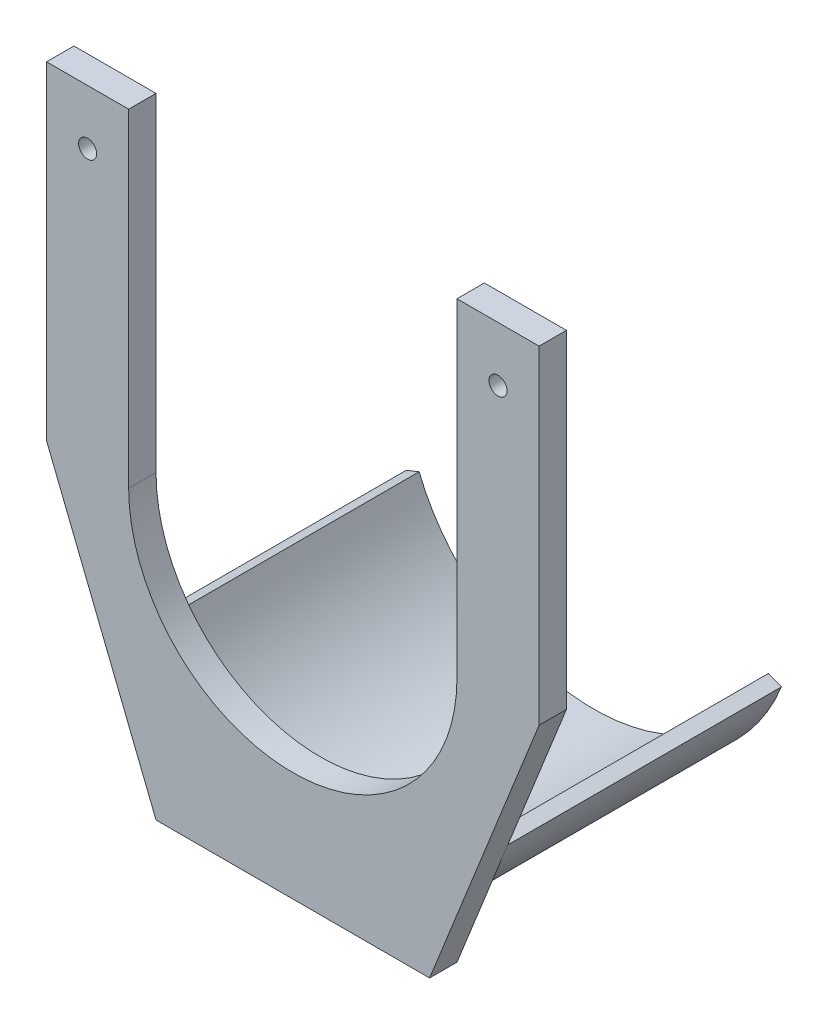
ISO-10303-21;
HEADER;
FILE_DESCRIPTION(('STEP AP214'),'2;1');
FILE_NAME('part.step','',(''),(''),'','','');
FILE_SCHEMA(('AUTOMOTIVE_DESIGN { 1 0 10303 214 1 1 1 1 }'));
ENDSEC;
DATA;
#1=APPLICATION_CONTEXT('core data for automotive mechanical design processes');
#2=APPLICATION_PROTOCOL_DEFINITION('international standard','automotive_design',2000,#1);
#3=PRODUCT_CONTEXT('',#1,'mechanical');
#4=PRODUCT('Part','Part','',(#3));
#5=PRODUCT_RELATED_PRODUCT_CATEGORY('part','',(#4));
#6=PRODUCT_DEFINITION_FORMATION('','',#4);
#7=PRODUCT_DEFINITION_CONTEXT('part definition',#1,'design');
#8=PRODUCT_DEFINITION('design','',#6,#7);
#9=PRODUCT_DEFINITION_SHAPE('','',#8);
#10=(LENGTH_UNIT() NAMED_UNIT(*) SI_UNIT(.MILLI.,.METRE.));
#11=(NAMED_UNIT(*) PLANE_ANGLE_UNIT() SI_UNIT($,.RADIAN.));
#12=(NAMED_UNIT(*) SI_UNIT($,.STERADIAN.) SOLID_ANGLE_UNIT());
#13=UNCERTAINTY_MEASURE_WITH_UNIT(LENGTH_MEASURE(1.E-05),#10,'distance_accuracy_value','');
#14=(GEOMETRIC_REPRESENTATION_CONTEXT(3) GLOBAL_UNCERTAINTY_ASSIGNED_CONTEXT((#13)) GLOBAL_UNIT_ASSIGNED_CONTEXT((#10,
#11,#12)) REPRESENTATION_CONTEXT('',''));
#15=CARTESIAN_POINT('',(0.,0.,0.));
#16=DIRECTION('',(0.,0.,1.));
#17=DIRECTION('',(1.,0.,0.));
#18=AXIS2_PLACEMENT_3D('',#15,#16,#17);
#19=CARTESIAN_POINT('',(0.,0.,0.));
#20=DIRECTION('',(0.,0.,1.));
#21=DIRECTION('',(1.,0.,0.));
#22=AXIS2_PLACEMENT_3D('',#19,#20,#21);
#23=PLANE('',#22);
#24=CARTESIAN_POINT('',(37.5,50.,0.));
#25=DIRECTION('',(0.,0.,1.));
#26=DIRECTION('',(-1.,0.,0.));
#27=AXIS2_PLACEMENT_3D('',#24,#25,#26);
#28=CIRCLE('',#27,1.65);
#29=CARTESIAN_POINT('',(35.85,50.,0.));
#30=VERTEX_POINT('',#29);
#31=EDGE_CURVE('E160',#30,#30,#28,.T.);
#32=ORIENTED_EDGE('',*,*,#31,.T.);
#33=EDGE_LOOP('',(#32));
#34=FACE_BOUND('',#33,.T.);
#35=CARTESIAN_POINT('',(-37.5,50.,0.));
#36=DIRECTION('',(0.,0.,1.));
#37=DIRECTION('',(1.,0.,0.));
#38=AXIS2_PLACEMENT_3D('',#35,#36,#37);
#39=CIRCLE('',#38,1.65);
#40=CARTESIAN_POINT('',(-35.85,50.,0.));
#41=VERTEX_POINT('',#40);
#42=EDGE_CURVE('E170',#41,#41,#39,.T.);
#43=ORIENTED_EDGE('',*,*,#42,.T.);
#44=EDGE_LOOP('',(#43));
#45=FACE_BOUND('',#44,.T.);
#46=DIRECTION('',(0.92847669088526,0.371390676354104,0.));
#47=VECTOR('',#46,1.);
#48=CARTESIAN_POINT('',(-31.9165535313274,-25.8407973768585,0.));
#49=LINE('',#48,#47);
#50=CARTESIAN_POINT('',(-34.2847669088526,-26.7880827278685,0.));
#51=VERTEX_POINT('',#50);
#52=CARTESIAN_POINT('',(-31.9165535313274,-25.8407973768585,0.));
#53=VERTEX_POINT('',#52);
#54=EDGE_CURVE('E157',#51,#53,#49,.T.);
#55=ORIENTED_EDGE('',*,*,#54,.F.);
#56=DIRECTION('',(0.371390676354104,-0.928476690885259,0.));
#57=VECTOR('',#56,1.);
#58=CARTESIAN_POINT('',(-45.,0.,0.));
#59=LINE('',#58,#57);
#60=CARTESIAN_POINT('',(-45.,0.,0.));
#61=VERTEX_POINT('',#60);
#62=EDGE_CURVE('E201',#61,#51,#59,.T.);
#63=ORIENTED_EDGE('',*,*,#62,.F.);
#64=DIRECTION('',(0.,-1.,0.));
#65=VECTOR('',#64,1.);
#66=CARTESIAN_POINT('',(-45.,0.,0.));
#67=LINE('',#66,#65);
#68=CARTESIAN_POINT('',(-45.,60.,0.));
#69=VERTEX_POINT('',#68);
#70=EDGE_CURVE('E182',#69,#61,#67,.T.);
#71=ORIENTED_EDGE('',*,*,#70,.F.);
#72=DIRECTION('',(-1.,0.,0.));
#73=VECTOR('',#72,1.);
#74=CARTESIAN_POINT('',(-45.,60.,0.));
#75=LINE('',#74,#73);
#76=CARTESIAN_POINT('',(-30.,60.,0.));
#77=VERTEX_POINT('',#76);
#78=EDGE_CURVE('E221',#77,#69,#75,.T.);
#79=ORIENTED_EDGE('',*,*,#78,.F.);
#80=DIRECTION('',(0.,1.,0.));
#81=VECTOR('',#80,1.);
#82=CARTESIAN_POINT('',(-30.,0.,0.));
#83=LINE('',#82,#81);
#84=CARTESIAN_POINT('',(-30.,0.,0.));
#85=VERTEX_POINT('',#84);
#86=EDGE_CURVE('E219',#85,#77,#83,.T.);
#87=ORIENTED_EDGE('',*,*,#86,.F.);
#88=CARTESIAN_POINT('',(0.,0.,0.));
#89=DIRECTION('',(0.,0.,-1.));
#90=DIRECTION('',(1.,0.,0.));
#91=AXIS2_PLACEMENT_3D('',#88,#89,#90);
#92=CIRCLE('',#91,30.);
#93=CARTESIAN_POINT('',(30.,0.,0.));
#94=VERTEX_POINT('',#93);
#95=EDGE_CURVE('E217',#94,#85,#92,.T.);
#96=ORIENTED_EDGE('',*,*,#95,.F.);
#97=DIRECTION('',(0.,-1.,0.));
#98=VECTOR('',#97,1.);
#99=CARTESIAN_POINT('',(30.,0.,0.));
#100=LINE('',#99,#98);
#101=CARTESIAN_POINT('',(30.,60.,0.));
#102=VERTEX_POINT('',#101);
#103=EDGE_CURVE('E215',#102,#94,#100,.T.);
#104=ORIENTED_EDGE('',*,*,#103,.F.);
#105=DIRECTION('',(-1.,0.,0.));
#106=VECTOR('',#105,1.);
#107=CARTESIAN_POINT('',(45.,60.,0.));
#108=LINE('',#107,#106);
#109=CARTESIAN_POINT('',(45.,60.,0.));
#110=VERTEX_POINT('',#109);
#111=EDGE_CURVE('E213',#110,#102,#108,.T.);
#112=ORIENTED_EDGE('',*,*,#111,.F.);
#113=DIRECTION('',(0.,1.,0.));
#114=VECTOR('',#113,1.);
#115=CARTESIAN_POINT('',(45.,0.,0.));
#116=LINE('',#115,#114);
#117=CARTESIAN_POINT('',(45.,0.,0.));
#118=VERTEX_POINT('',#117);
#119=EDGE_CURVE('E211',#118,#110,#116,.T.);
#120=ORIENTED_EDGE('',*,*,#119,.F.);
#121=DIRECTION('',(0.371390676354103,0.928476690885259,0.));
#122=VECTOR('',#121,1.);
#123=CARTESIAN_POINT('',(45.,0.,0.));
#124=LINE('',#123,#122);
#125=CARTESIAN_POINT('',(34.2847669088526,-26.7880827278685,0.));
#126=VERTEX_POINT('',#125);
#127=EDGE_CURVE('E208',#126,#118,#124,.T.);
#128=ORIENTED_EDGE('',*,*,#127,.F.);
#129=DIRECTION('',(0.92847669088526,-0.371390676354104,0.));
#130=VECTOR('',#129,1.);
#131=CARTESIAN_POINT('',(31.9165535313274,-25.8407973768585,0.));
#132=LINE('',#131,#130);
#133=CARTESIAN_POINT('',(31.9165535313274,-25.8407973768585,0.));
#134=VERTEX_POINT('',#133);
#135=EDGE_CURVE('E55',#134,#126,#132,.T.);
#136=ORIENTED_EDGE('',*,*,#135,.F.);
#137=CARTESIAN_POINT('',(0.,-13.0741759643275,0.));
#138=DIRECTION('',(0.,0.,1.));
#139=DIRECTION('',(-1.,0.,0.));
#140=AXIS2_PLACEMENT_3D('',#137,#138,#139);
#141=CIRCLE('',#140,34.3751801683858);
#142=EDGE_CURVE('E50',#53,#134,#141,.T.);
#143=ORIENTED_EDGE('',*,*,#142,.F.);
#144=EDGE_LOOP('',(#55,#63,#71,#79,#87,#96,#104,#112,#120,#128,#136,#143));
#145=FACE_BOUND('',#144,.T.);
#146=ADVANCED_FACE('F33',(#34,#45,#145),#23,.F.);
#147=CARTESIAN_POINT('',(0.,-13.0741759643275,0.));
#148=DIRECTION('',(0.,0.,-1.));
#149=DIRECTION('',(-1.,0.,0.));
#150=AXIS2_PLACEMENT_3D('',#147,#148,#149);
#151=CIRCLE('',#150,36.9258240356725);
#152=CARTESIAN_POINT('',(0.,-50.,0.));
#153=VERTEX_POINT('',#152);
#154=EDGE_CURVE('E11',#153,#51,#151,.T.);
#155=ORIENTED_EDGE('',*,*,#154,.F.);
#156=DIRECTION('',(1.,0.,0.));
#157=VECTOR('',#156,1.);
#158=CARTESIAN_POINT('',(-25.,-50.,0.));
#159=LINE('',#158,#157);
#160=CARTESIAN_POINT('',(-25.,-50.,0.));
#161=VERTEX_POINT('',#160);
#162=EDGE_CURVE('E205',#161,#153,#159,.T.);
#163=ORIENTED_EDGE('',*,*,#162,.F.);
#164=EDGE_CURVE('E175',#51,#161,#59,.T.);
#165=ORIENTED_EDGE('',*,*,#164,.F.);
#166=EDGE_LOOP('',(#155,#163,#165));
#167=FACE_BOUND('',#166,.T.);
#168=ADVANCED_FACE('F263',(#167),#23,.F.);
#169=EDGE_CURVE('E43',#126,#153,#151,.T.);
#170=ORIENTED_EDGE('',*,*,#169,.F.);
#171=CARTESIAN_POINT('',(25.,-50.,0.));
#172=VERTEX_POINT('',#171);
#173=EDGE_CURVE('E209',#172,#126,#124,.T.);
#174=ORIENTED_EDGE('',*,*,#173,.F.);
#175=EDGE_CURVE('E204',#153,#172,#159,.T.);
#176=ORIENTED_EDGE('',*,*,#175,.F.);
#177=EDGE_LOOP('',(#170,#174,#176));
#178=FACE_BOUND('',#177,.T.);
#179=ADVANCED_FACE('F270',(#178),#23,.F.);
#180=CARTESIAN_POINT('',(0.,0.,5.));
#181=DIRECTION('',(0.,0.,1.));
#182=DIRECTION('',(1.,0.,0.));
#183=AXIS2_PLACEMENT_3D('',#180,#181,#182);
#184=PLANE('',#183);
#185=CARTESIAN_POINT('',(-37.5,50.,5.));
#186=DIRECTION('',(0.,0.,1.));
#187=DIRECTION('',(1.,0.,0.));
#188=AXIS2_PLACEMENT_3D('',#185,#186,#187);
#189=CIRCLE('',#188,1.65);
#190=CARTESIAN_POINT('',(-35.85,50.,5.));
#191=VERTEX_POINT('',#190);
#192=EDGE_CURVE('E172',#191,#191,#189,.T.);
#193=ORIENTED_EDGE('',*,*,#192,.F.);
#194=EDGE_LOOP('',(#193));
#195=FACE_BOUND('',#194,.T.);
#196=DIRECTION('',(0.371390676354104,-0.928476690885259,0.));
#197=VECTOR('',#196,1.);
#198=CARTESIAN_POINT('',(-45.,0.,5.));
#199=LINE('',#198,#197);
#200=CARTESIAN_POINT('',(-45.,0.,5.));
#201=VERTEX_POINT('',#200);
#202=CARTESIAN_POINT('',(-25.,-50.,5.));
#203=VERTEX_POINT('',#202);
#204=EDGE_CURVE('E178',#201,#203,#199,.T.);
#205=ORIENTED_EDGE('',*,*,#204,.T.);
#206=DIRECTION('',(1.,0.,0.));
#207=VECTOR('',#206,1.);
#208=CARTESIAN_POINT('',(-25.,-50.,5.));
#209=LINE('',#208,#207);
#210=CARTESIAN_POINT('',(25.,-50.,5.));
#211=VERTEX_POINT('',#210);
#212=EDGE_CURVE('E181',#203,#211,#209,.T.);
#213=ORIENTED_EDGE('',*,*,#212,.T.);
#214=DIRECTION('',(0.371390676354103,0.928476690885259,0.));
#215=VECTOR('',#214,1.);
#216=CARTESIAN_POINT('',(45.,0.,5.));
#217=LINE('',#216,#215);
#218=CARTESIAN_POINT('',(45.,0.,5.));
#219=VERTEX_POINT('',#218);
#220=EDGE_CURVE('E184',#211,#219,#217,.T.);
#221=ORIENTED_EDGE('',*,*,#220,.T.);
#222=DIRECTION('',(0.,1.,0.));
#223=VECTOR('',#222,1.);
#224=CARTESIAN_POINT('',(45.,0.,5.));
#225=LINE('',#224,#223);
#226=CARTESIAN_POINT('',(45.,60.,5.));
#227=VERTEX_POINT('',#226);
#228=EDGE_CURVE('E186',#219,#227,#225,.T.);
#229=ORIENTED_EDGE('',*,*,#228,.T.);
#230=DIRECTION('',(-1.,0.,0.));
#231=VECTOR('',#230,1.);
#232=CARTESIAN_POINT('',(45.,60.,5.));
#233=LINE('',#232,#231);
#234=CARTESIAN_POINT('',(30.,60.,5.));
#235=VERTEX_POINT('',#234);
#236=EDGE_CURVE('E188',#227,#235,#233,.T.);
#237=ORIENTED_EDGE('',*,*,#236,.T.);
#238=DIRECTION('',(0.,-1.,0.));
#239=VECTOR('',#238,1.);
#240=CARTESIAN_POINT('',(30.,0.,5.));
#241=LINE('',#240,#239);
#242=CARTESIAN_POINT('',(30.,0.,5.));
#243=VERTEX_POINT('',#242);
#244=EDGE_CURVE('E190',#235,#243,#241,.T.);
#245=ORIENTED_EDGE('',*,*,#244,.T.);
#246=CARTESIAN_POINT('',(0.,0.,5.));
#247=DIRECTION('',(0.,0.,-1.));
#248=DIRECTION('',(1.,0.,0.));
#249=AXIS2_PLACEMENT_3D('',#246,#247,#248);
#250=CIRCLE('',#249,30.);
#251=CARTESIAN_POINT('',(-30.,0.,5.));
#252=VERTEX_POINT('',#251);
#253=EDGE_CURVE('E192',#243,#252,#250,.T.);
#254=ORIENTED_EDGE('',*,*,#253,.T.);
#255=DIRECTION('',(0.,1.,0.));
#256=VECTOR('',#255,1.);
#257=CARTESIAN_POINT('',(-30.,0.,5.));
#258=LINE('',#257,#256);
#259=CARTESIAN_POINT('',(-30.,60.,5.));
#260=VERTEX_POINT('',#259);
#261=EDGE_CURVE('E194',#252,#260,#258,.T.);
#262=ORIENTED_EDGE('',*,*,#261,.T.);
#263=DIRECTION('',(-1.,0.,0.));
#264=VECTOR('',#263,1.);
#265=CARTESIAN_POINT('',(-45.,60.,5.));
#266=LINE('',#265,#264);
#267=CARTESIAN_POINT('',(-45.,60.,5.));
#268=VERTEX_POINT('',#267);
#269=EDGE_CURVE('E196',#260,#268,#266,.T.);
#270=ORIENTED_EDGE('',*,*,#269,.T.);
#271=DIRECTION('',(0.,-1.,0.));
#272=VECTOR('',#271,1.);
#273=CARTESIAN_POINT('',(-45.,0.,5.));
#274=LINE('',#273,#272);
#275=EDGE_CURVE('E198',#268,#201,#274,.T.);
#276=ORIENTED_EDGE('',*,*,#275,.T.);
#277=EDGE_LOOP('',(#205,#213,#221,#229,#237,#245,#254,#262,#270,#276));
#278=FACE_BOUND('',#277,.T.);
#279=CARTESIAN_POINT('',(37.5,50.,5.));
#280=DIRECTION('',(0.,0.,1.));
#281=DIRECTION('',(-1.,0.,0.));
#282=AXIS2_PLACEMENT_3D('',#279,#280,#281);
#283=CIRCLE('',#282,1.65);
#284=CARTESIAN_POINT('',(35.85,50.,5.));
#285=VERTEX_POINT('',#284);
#286=EDGE_CURVE('E163',#285,#285,#283,.T.);
#287=ORIENTED_EDGE('',*,*,#286,.F.);
#288=EDGE_LOOP('',(#287));
#289=FACE_BOUND('',#288,.T.);
#290=ADVANCED_FACE('F275',(#195,#278,#289),#184,.T.);
#291=CARTESIAN_POINT('',(-45.,0.,5.));
#292=DIRECTION('',(0.928476690885259,0.371390676354104,0.));
#293=DIRECTION('',(-0.371390676354104,0.928476690885259,0.));
#294=AXIS2_PLACEMENT_3D('',#291,#292,#293);
#295=PLANE('',#294);
#296=ORIENTED_EDGE('',*,*,#62,.T.);
#297=ORIENTED_EDGE('',*,*,#164,.T.);
#298=DIRECTION('',(0.,0.,-1.));
#299=VECTOR('',#298,1.);
#300=CARTESIAN_POINT('',(-25.,-50.,5.));
#301=LINE('',#300,#299);
#302=EDGE_CURVE('E37',#203,#161,#301,.T.);
#303=ORIENTED_EDGE('',*,*,#302,.F.);
#304=ORIENTED_EDGE('',*,*,#204,.F.);
#305=DIRECTION('',(0.,0.,-1.));
#306=VECTOR('',#305,1.);
#307=CARTESIAN_POINT('',(-45.,0.,5.));
#308=LINE('',#307,#306);
#309=EDGE_CURVE('E200',#201,#61,#308,.T.);
#310=ORIENTED_EDGE('',*,*,#309,.T.);
#311=EDGE_LOOP('',(#296,#297,#303,#304,#310));
#312=FACE_BOUND('',#311,.T.);
#313=ADVANCED_FACE('F35',(#312),#295,.F.);
#314=CARTESIAN_POINT('',(-25.,-50.,5.));
#315=DIRECTION('',(0.,1.,0.));
#316=DIRECTION('',(-1.,0.,0.));
#317=AXIS2_PLACEMENT_3D('',#314,#315,#316);
#318=PLANE('',#317);
#319=ORIENTED_EDGE('',*,*,#162,.T.);
#320=ORIENTED_EDGE('',*,*,#175,.T.);
#321=DIRECTION('',(0.,0.,-1.));
#322=VECTOR('',#321,1.);
#323=CARTESIAN_POINT('',(25.,-50.,5.));
#324=LINE('',#323,#322);
#325=EDGE_CURVE('E246',#211,#172,#324,.T.);
#326=ORIENTED_EDGE('',*,*,#325,.F.);
#327=ORIENTED_EDGE('',*,*,#212,.F.);
#328=ORIENTED_EDGE('',*,*,#302,.T.);
#329=EDGE_LOOP('',(#319,#320,#326,#327,#328));
#330=FACE_BOUND('',#329,.T.);
#331=ADVANCED_FACE('F255',(#330),#318,.F.);
#332=CARTESIAN_POINT('',(45.,0.,5.));
#333=DIRECTION('',(-0.92847669088526,0.371390676354103,0.));
#334=DIRECTION('',(-0.371390676354103,-0.92847669088526,0.));
#335=AXIS2_PLACEMENT_3D('',#332,#333,#334);
#336=PLANE('',#335);
#337=ORIENTED_EDGE('',*,*,#173,.T.);
#338=ORIENTED_EDGE('',*,*,#127,.T.);
#339=DIRECTION('',(0.,0.,-1.));
#340=VECTOR('',#339,1.);
#341=CARTESIAN_POINT('',(45.,0.,5.));
#342=LINE('',#341,#340);
#343=EDGE_CURVE('E244',#219,#118,#342,.T.);
#344=ORIENTED_EDGE('',*,*,#343,.F.);
#345=ORIENTED_EDGE('',*,*,#220,.F.);
#346=ORIENTED_EDGE('',*,*,#325,.T.);
#347=EDGE_LOOP('',(#337,#338,#344,#345,#346));
#348=FACE_BOUND('',#347,.T.);
#349=ADVANCED_FACE('F272',(#348),#336,.F.);
#350=CARTESIAN_POINT('',(45.,0.,5.));
#351=DIRECTION('',(-1.,0.,0.));
#352=DIRECTION('',(0.,0.,1.));
#353=AXIS2_PLACEMENT_3D('',#350,#351,#352);
#354=PLANE('',#353);
#355=ORIENTED_EDGE('',*,*,#119,.T.);
#356=DIRECTION('',(0.,0.,-1.));
#357=VECTOR('',#356,1.);
#358=CARTESIAN_POINT('',(45.,60.,5.));
#359=LINE('',#358,#357);
#360=EDGE_CURVE('E241',#227,#110,#359,.T.);
#361=ORIENTED_EDGE('',*,*,#360,.F.);
#362=ORIENTED_EDGE('',*,*,#228,.F.);
#363=ORIENTED_EDGE('',*,*,#343,.T.);
#364=EDGE_LOOP('',(#355,#361,#362,#363));
#365=FACE_BOUND('',#364,.T.);
#366=ADVANCED_FACE('F446',(#365),#354,.F.);
#367=CARTESIAN_POINT('',(45.,60.,5.));
#368=DIRECTION('',(0.,-1.,0.));
#369=DIRECTION('',(0.,0.,-1.));
#370=AXIS2_PLACEMENT_3D('',#367,#368,#369);
#371=PLANE('',#370);
#372=ORIENTED_EDGE('',*,*,#111,.T.);
#373=DIRECTION('',(0.,0.,-1.));
#374=VECTOR('',#373,1.);
#375=CARTESIAN_POINT('',(30.,60.,5.));
#376=LINE('',#375,#374);
#377=EDGE_CURVE('E238',#235,#102,#376,.T.);
#378=ORIENTED_EDGE('',*,*,#377,.F.);
#379=ORIENTED_EDGE('',*,*,#236,.F.);
#380=ORIENTED_EDGE('',*,*,#360,.T.);
#381=EDGE_LOOP('',(#372,#378,#379,#380));
#382=FACE_BOUND('',#381,.T.);
#383=ADVANCED_FACE('F437',(#382),#371,.F.);
#384=CARTESIAN_POINT('',(30.,0.,5.));
#385=DIRECTION('',(1.,0.,0.));
#386=DIRECTION('',(0.,0.,-1.));
#387=AXIS2_PLACEMENT_3D('',#384,#385,#386);
#388=PLANE('',#387);
#389=ORIENTED_EDGE('',*,*,#103,.T.);
#390=DIRECTION('',(0.,0.,-1.));
#391=VECTOR('',#390,1.);
#392=CARTESIAN_POINT('',(30.,0.,5.));
#393=LINE('',#392,#391);
#394=EDGE_CURVE('E235',#243,#94,#393,.T.);
#395=ORIENTED_EDGE('',*,*,#394,.F.);
#396=ORIENTED_EDGE('',*,*,#244,.F.);
#397=ORIENTED_EDGE('',*,*,#377,.T.);
#398=EDGE_LOOP('',(#389,#395,#396,#397));
#399=FACE_BOUND('',#398,.T.);
#400=ADVANCED_FACE('F428',(#399),#388,.F.);
#401=CARTESIAN_POINT('',(0.,0.,5.));
#402=DIRECTION('',(0.,0.,-1.));
#403=DIRECTION('',(-1.,0.,0.));
#404=AXIS2_PLACEMENT_3D('',#401,#402,#403);
#405=CYLINDRICAL_SURFACE('',#404,30.);
#406=ORIENTED_EDGE('',*,*,#95,.T.);
#407=DIRECTION('',(0.,0.,-1.));
#408=VECTOR('',#407,1.);
#409=CARTESIAN_POINT('',(-30.,0.,5.));
#410=LINE('',#409,#408);
#411=EDGE_CURVE('E232',#252,#85,#410,.T.);
#412=ORIENTED_EDGE('',*,*,#411,.F.);
#413=ORIENTED_EDGE('',*,*,#253,.F.);
#414=ORIENTED_EDGE('',*,*,#394,.T.);
#415=EDGE_LOOP('',(#406,#412,#413,#414));
#416=FACE_BOUND('',#415,.T.);
#417=ADVANCED_FACE('F419',(#416),#405,.F.);
#418=CARTESIAN_POINT('',(-30.,0.,5.));
#419=DIRECTION('',(-1.,0.,0.));
#420=DIRECTION('',(0.,0.,1.));
#421=AXIS2_PLACEMENT_3D('',#418,#419,#420);
#422=PLANE('',#421);
#423=ORIENTED_EDGE('',*,*,#86,.T.);
#424=DIRECTION('',(0.,0.,-1.));
#425=VECTOR('',#424,1.);
#426=CARTESIAN_POINT('',(-30.,60.,5.));
#427=LINE('',#426,#425);
#428=EDGE_CURVE('E229',#260,#77,#427,.T.);
#429=ORIENTED_EDGE('',*,*,#428,.F.);
#430=ORIENTED_EDGE('',*,*,#261,.F.);
#431=ORIENTED_EDGE('',*,*,#411,.T.);
#432=EDGE_LOOP('',(#423,#429,#430,#431));
#433=FACE_BOUND('',#432,.T.);
#434=ADVANCED_FACE('F410',(#433),#422,.F.);
#435=CARTESIAN_POINT('',(-45.,60.,5.));
#436=DIRECTION('',(0.,-1.,0.));
#437=DIRECTION('',(0.,0.,-1.));
#438=AXIS2_PLACEMENT_3D('',#435,#436,#437);
#439=PLANE('',#438);
#440=ORIENTED_EDGE('',*,*,#78,.T.);
#441=DIRECTION('',(0.,0.,-1.));
#442=VECTOR('',#441,1.);
#443=CARTESIAN_POINT('',(-45.,60.,5.));
#444=LINE('',#443,#442);
#445=EDGE_CURVE('E226',#268,#69,#444,.T.);
#446=ORIENTED_EDGE('',*,*,#445,.F.);
#447=ORIENTED_EDGE('',*,*,#269,.F.);
#448=ORIENTED_EDGE('',*,*,#428,.T.);
#449=EDGE_LOOP('',(#440,#446,#447,#448));
#450=FACE_BOUND('',#449,.T.);
#451=ADVANCED_FACE('F403',(#450),#439,.F.);
#452=CARTESIAN_POINT('',(-45.,0.,5.));
#453=DIRECTION('',(1.,0.,0.));
#454=DIRECTION('',(0.,0.,-1.));
#455=AXIS2_PLACEMENT_3D('',#452,#453,#454);
#456=PLANE('',#455);
#457=ORIENTED_EDGE('',*,*,#70,.T.);
#458=ORIENTED_EDGE('',*,*,#309,.F.);
#459=ORIENTED_EDGE('',*,*,#275,.F.);
#460=ORIENTED_EDGE('',*,*,#445,.T.);
#461=EDGE_LOOP('',(#457,#458,#459,#460));
#462=FACE_BOUND('',#461,.T.);
#463=ADVANCED_FACE('F283',(#462),#456,.F.);
#464=CARTESIAN_POINT('',(-37.5,50.,5.));
#465=DIRECTION('',(0.,0.,-1.));
#466=DIRECTION('',(-1.,0.,0.));
#467=AXIS2_PLACEMENT_3D('',#464,#465,#466);
#468=CYLINDRICAL_SURFACE('',#467,1.65);
#469=ORIENTED_EDGE('',*,*,#192,.T.);
#470=EDGE_LOOP('',(#469));
#471=FACE_BOUND('',#470,.T.);
#472=ORIENTED_EDGE('',*,*,#42,.F.);
#473=EDGE_LOOP('',(#472));
#474=FACE_BOUND('',#473,.T.);
#475=ADVANCED_FACE('F325',(#471,#474),#468,.F.);
#476=CARTESIAN_POINT('',(37.5,50.,5.));
#477=DIRECTION('',(0.,0.,-1.));
#478=DIRECTION('',(-1.,0.,0.));
#479=AXIS2_PLACEMENT_3D('',#476,#477,#478);
#480=CYLINDRICAL_SURFACE('',#479,1.65);
#481=ORIENTED_EDGE('',*,*,#286,.T.);
#482=EDGE_LOOP('',(#481));
#483=FACE_BOUND('',#482,.T.);
#484=ORIENTED_EDGE('',*,*,#31,.F.);
#485=EDGE_LOOP('',(#484));
#486=FACE_BOUND('',#485,.T.);
#487=ADVANCED_FACE('F328',(#483,#486),#480,.F.);
#488=CARTESIAN_POINT('',(0.,-13.0741759643275,-50.));
#489=DIRECTION('',(0.,0.,1.));
#490=DIRECTION('',(1.,0.,0.));
#491=AXIS2_PLACEMENT_3D('',#488,#489,#490);
#492=CYLINDRICAL_SURFACE('',#491,34.3751801683858);
#493=ORIENTED_EDGE('',*,*,#142,.T.);
#494=DIRECTION('',(0.,0.,1.));
#495=VECTOR('',#494,1.);
#496=CARTESIAN_POINT('',(31.9165535313274,-25.8407973768585,-50.));
#497=LINE('',#496,#495);
#498=CARTESIAN_POINT('',(31.9165535313274,-25.8407973768585,-50.));
#499=VERTEX_POINT('',#498);
#500=EDGE_CURVE('E142',#499,#134,#497,.T.);
#501=ORIENTED_EDGE('',*,*,#500,.F.);
#502=CARTESIAN_POINT('',(0.,-13.0741759643275,-50.));
#503=DIRECTION('',(0.,0.,1.));
#504=DIRECTION('',(-1.,0.,0.));
#505=AXIS2_PLACEMENT_3D('',#502,#503,#504);
#506=CIRCLE('',#505,34.3751801683858);
#507=CARTESIAN_POINT('',(-31.9165535313274,-25.8407973768585,-50.));
#508=VERTEX_POINT('',#507);
#509=EDGE_CURVE('E148',#508,#499,#506,.T.);
#510=ORIENTED_EDGE('',*,*,#509,.F.);
#511=DIRECTION('',(0.,0.,1.));
#512=VECTOR('',#511,1.);
#513=CARTESIAN_POINT('',(-31.9165535313274,-25.8407973768585,-50.));
#514=LINE('',#513,#512);
#515=EDGE_CURVE('E290',#508,#53,#514,.T.);
#516=ORIENTED_EDGE('',*,*,#515,.T.);
#517=EDGE_LOOP('',(#493,#501,#510,#516));
#518=FACE_BOUND('',#517,.T.);
#519=ADVANCED_FACE('F159',(#518),#492,.F.);
#520=CARTESIAN_POINT('',(31.9165535313274,-25.8407973768585,-50.));
#521=DIRECTION('',(-0.371390676354103,-0.928476690885259,0.));
#522=DIRECTION('',(0.928476690885259,-0.371390676354103,0.));
#523=AXIS2_PLACEMENT_3D('',#520,#521,#522);
#524=PLANE('',#523);
#525=ORIENTED_EDGE('',*,*,#135,.T.);
#526=DIRECTION('',(0.,0.,1.));
#527=VECTOR('',#526,1.);
#528=CARTESIAN_POINT('',(34.2847669088526,-26.7880827278685,-50.));
#529=LINE('',#528,#527);
#530=CARTESIAN_POINT('',(34.2847669088526,-26.7880827278685,-50.));
#531=VERTEX_POINT('',#530);
#532=EDGE_CURVE('E144',#531,#126,#529,.T.);
#533=ORIENTED_EDGE('',*,*,#532,.F.);
#534=DIRECTION('',(0.92847669088526,-0.371390676354104,0.));
#535=VECTOR('',#534,1.);
#536=CARTESIAN_POINT('',(31.9165535313274,-25.8407973768585,-50.));
#537=LINE('',#536,#535);
#538=EDGE_CURVE('E138',#499,#531,#537,.T.);
#539=ORIENTED_EDGE('',*,*,#538,.F.);
#540=ORIENTED_EDGE('',*,*,#500,.T.);
#541=EDGE_LOOP('',(#525,#533,#539,#540));
#542=FACE_BOUND('',#541,.T.);
#543=ADVANCED_FACE('F140',(#542),#524,.F.);
#544=CARTESIAN_POINT('',(0.,-13.0741759643275,-50.));
#545=DIRECTION('',(0.,0.,1.));
#546=DIRECTION('',(1.,0.,0.));
#547=AXIS2_PLACEMENT_3D('',#544,#545,#546);
#548=CYLINDRICAL_SURFACE('',#547,36.9258240356725);
#549=ORIENTED_EDGE('',*,*,#169,.T.);
#550=ORIENTED_EDGE('',*,*,#154,.T.);
#551=DIRECTION('',(0.,0.,1.));
#552=VECTOR('',#551,1.);
#553=CARTESIAN_POINT('',(-34.2847669088526,-26.7880827278685,-50.));
#554=LINE('',#553,#552);
#555=CARTESIAN_POINT('',(-34.2847669088526,-26.7880827278685,-50.));
#556=VERTEX_POINT('',#555);
#557=EDGE_CURVE('E165',#556,#51,#554,.T.);
#558=ORIENTED_EDGE('',*,*,#557,.F.);
#559=CARTESIAN_POINT('',(0.,-13.0741759643275,-50.));
#560=DIRECTION('',(0.,0.,-1.));
#561=DIRECTION('',(-1.,0.,0.));
#562=AXIS2_PLACEMENT_3D('',#559,#560,#561);
#563=CIRCLE('',#562,36.9258240356725);
#564=EDGE_CURVE('E147',#531,#556,#563,.T.);
#565=ORIENTED_EDGE('',*,*,#564,.F.);
#566=ORIENTED_EDGE('',*,*,#532,.T.);
#567=EDGE_LOOP('',(#549,#550,#558,#565,#566));
#568=FACE_BOUND('',#567,.T.);
#569=ADVANCED_FACE('F292',(#568),#548,.T.);
#570=CARTESIAN_POINT('',(-31.9165535313274,-25.8407973768585,-50.));
#571=DIRECTION('',(0.371390676354103,-0.928476690885259,0.));
#572=DIRECTION('',(0.928476690885259,0.371390676354103,0.));
#573=AXIS2_PLACEMENT_3D('',#570,#571,#572);
#574=PLANE('',#573);
#575=ORIENTED_EDGE('',*,*,#54,.T.);
#576=ORIENTED_EDGE('',*,*,#515,.F.);
#577=DIRECTION('',(0.92847669088526,0.371390676354104,0.));
#578=VECTOR('',#577,1.);
#579=CARTESIAN_POINT('',(-31.9165535313274,-25.8407973768585,-50.));
#580=LINE('',#579,#578);
#581=EDGE_CURVE('E153',#556,#508,#580,.T.);
#582=ORIENTED_EDGE('',*,*,#581,.F.);
#583=ORIENTED_EDGE('',*,*,#557,.T.);
#584=EDGE_LOOP('',(#575,#576,#582,#583));
#585=FACE_BOUND('',#584,.T.);
#586=ADVANCED_FACE('F291',(#585),#574,.F.);
#587=CARTESIAN_POINT('',(0.,-13.0741759643275,-50.));
#588=DIRECTION('',(0.,0.,-1.));
#589=DIRECTION('',(-1.,0.,0.));
#590=AXIS2_PLACEMENT_3D('',#587,#588,#589);
#591=PLANE('',#590);
#592=ORIENTED_EDGE('',*,*,#509,.T.);
#593=ORIENTED_EDGE('',*,*,#538,.T.);
#594=ORIENTED_EDGE('',*,*,#564,.T.);
#595=ORIENTED_EDGE('',*,*,#581,.T.);
#596=EDGE_LOOP('',(#592,#593,#594,#595));
#597=FACE_BOUND('',#596,.T.);
#598=ADVANCED_FACE('F151',(#597),#591,.T.);
#599=CLOSED_SHELL('',(#146,#168,#179,#290,#313,#331,#349,#366,#383,#400,#417,#434,#451,#463,
#475,#487,#519,#543,#569,#586,#598));
#600=MANIFOLD_SOLID_BREP('B2',#599);
#601=ADVANCED_BREP_SHAPE_REPRESENTATION('',(#18,#600),#14);
#602=SHAPE_DEFINITION_REPRESENTATION(#9,#601);
ENDSEC;
END-ISO-10303-21;
